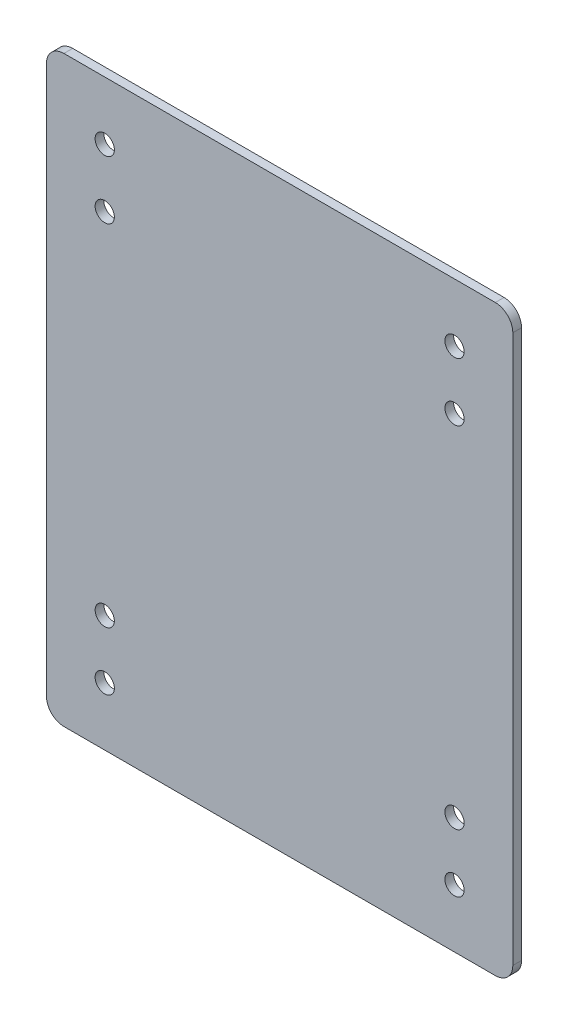
ISO-10303-21;
HEADER;
FILE_DESCRIPTION(('STEP AP214'),'2;1');
FILE_NAME('part.step','',(''),(''),'','','');
FILE_SCHEMA(('AUTOMOTIVE_DESIGN { 1 0 10303 214 1 1 1 1 }'));
ENDSEC;
DATA;
#1=APPLICATION_CONTEXT('core data for automotive mechanical design processes');
#2=APPLICATION_PROTOCOL_DEFINITION('international standard','automotive_design',2000,#1);
#3=PRODUCT_CONTEXT('',#1,'mechanical');
#4=PRODUCT('Part','Part','',(#3));
#5=PRODUCT_RELATED_PRODUCT_CATEGORY('part','',(#4));
#6=PRODUCT_DEFINITION_FORMATION('','',#4);
#7=PRODUCT_DEFINITION_CONTEXT('part definition',#1,'design');
#8=PRODUCT_DEFINITION('design','',#6,#7);
#9=PRODUCT_DEFINITION_SHAPE('','',#8);
#10=(LENGTH_UNIT() NAMED_UNIT(*) SI_UNIT(.MILLI.,.METRE.));
#11=(NAMED_UNIT(*) PLANE_ANGLE_UNIT() SI_UNIT($,.RADIAN.));
#12=(NAMED_UNIT(*) SI_UNIT($,.STERADIAN.) SOLID_ANGLE_UNIT());
#13=UNCERTAINTY_MEASURE_WITH_UNIT(LENGTH_MEASURE(1.E-05),#10,'distance_accuracy_value','');
#14=(GEOMETRIC_REPRESENTATION_CONTEXT(3) GLOBAL_UNCERTAINTY_ASSIGNED_CONTEXT((#13)) GLOBAL_UNIT_ASSIGNED_CONTEXT((#10,
#11,#12)) REPRESENTATION_CONTEXT('',''));
#15=CARTESIAN_POINT('',(0.,0.,0.));
#16=DIRECTION('',(0.,0.,1.));
#17=DIRECTION('',(1.,0.,0.));
#18=AXIS2_PLACEMENT_3D('',#15,#16,#17);
#19=CARTESIAN_POINT('',(77.,97.,0.));
#20=DIRECTION('',(0.,0.,1.));
#21=DIRECTION('',(1.,0.,0.));
#22=AXIS2_PLACEMENT_3D('',#19,#20,#21);
#23=CYLINDRICAL_SURFACE('',#22,3.);
#24=DIRECTION('',(0.,0.,1.));
#25=VECTOR('',#24,1.);
#26=CARTESIAN_POINT('',(80.,97.,0.));
#27=LINE('',#26,#25);
#28=CARTESIAN_POINT('',(80.,97.,-1.5));
#29=VERTEX_POINT('',#28);
#30=CARTESIAN_POINT('',(80.,97.,0.));
#31=VERTEX_POINT('',#30);
#32=EDGE_CURVE('E11',#29,#31,#27,.T.);
#33=ORIENTED_EDGE('',*,*,#32,.F.);
#34=CARTESIAN_POINT('',(77.,97.,-1.5));
#35=DIRECTION('',(0.,0.,1.));
#36=DIRECTION('',(1.,0.,0.));
#37=AXIS2_PLACEMENT_3D('',#34,#35,#36);
#38=CIRCLE('',#37,3.);
#39=CARTESIAN_POINT('',(77.,100.,-1.5));
#40=VERTEX_POINT('',#39);
#41=EDGE_CURVE('E107',#29,#40,#38,.T.);
#42=ORIENTED_EDGE('',*,*,#41,.T.);
#43=DIRECTION('',(0.,0.,1.));
#44=VECTOR('',#43,1.);
#45=CARTESIAN_POINT('',(77.,100.,0.));
#46=LINE('',#45,#44);
#47=CARTESIAN_POINT('',(77.,100.,0.));
#48=VERTEX_POINT('',#47);
#49=EDGE_CURVE('E50',#40,#48,#46,.T.);
#50=ORIENTED_EDGE('',*,*,#49,.T.);
#51=CARTESIAN_POINT('',(77.,97.,0.));
#52=DIRECTION('',(0.,0.,1.));
#53=DIRECTION('',(-1.,0.,0.));
#54=AXIS2_PLACEMENT_3D('',#51,#52,#53);
#55=CIRCLE('',#54,3.);
#56=EDGE_CURVE('E160',#31,#48,#55,.T.);
#57=ORIENTED_EDGE('',*,*,#56,.F.);
#58=EDGE_LOOP('',(#33,#42,#50,#57));
#59=FACE_BOUND('',#58,.T.);
#60=ADVANCED_FACE('F40',(#59),#23,.T.);
#61=CARTESIAN_POINT('',(3.00000000000002,100.,0.));
#62=DIRECTION('',(0.,1.,0.));
#63=DIRECTION('',(-1.,0.,0.));
#64=AXIS2_PLACEMENT_3D('',#61,#62,#63);
#65=PLANE('',#64);
#66=ORIENTED_EDGE('',*,*,#49,.F.);
#67=DIRECTION('',(1.,0.,0.));
#68=VECTOR('',#67,1.);
#69=CARTESIAN_POINT('',(77.,100.,-1.5));
#70=LINE('',#69,#68);
#71=CARTESIAN_POINT('',(3.00000000000002,100.,-1.5));
#72=VERTEX_POINT('',#71);
#73=EDGE_CURVE('E138',#40,#72,#70,.F.);
#74=ORIENTED_EDGE('',*,*,#73,.T.);
#75=DIRECTION('',(0.,0.,1.));
#76=VECTOR('',#75,1.);
#77=CARTESIAN_POINT('',(3.00000000000002,100.,0.));
#78=LINE('',#77,#76);
#79=CARTESIAN_POINT('',(3.00000000000002,100.,0.));
#80=VERTEX_POINT('',#79);
#81=EDGE_CURVE('E153',#72,#80,#78,.T.);
#82=ORIENTED_EDGE('',*,*,#81,.T.);
#83=DIRECTION('',(-1.,0.,0.));
#84=VECTOR('',#83,1.);
#85=CARTESIAN_POINT('',(3.00000000000002,100.,0.));
#86=LINE('',#85,#84);
#87=EDGE_CURVE('E169',#48,#80,#86,.T.);
#88=ORIENTED_EDGE('',*,*,#87,.F.);
#89=EDGE_LOOP('',(#66,#74,#82,#88));
#90=FACE_BOUND('',#89,.T.);
#91=ADVANCED_FACE('F173',(#90),#65,.T.);
#92=CARTESIAN_POINT('',(3.,97.,0.));
#93=DIRECTION('',(0.,0.,1.));
#94=DIRECTION('',(1.,0.,0.));
#95=AXIS2_PLACEMENT_3D('',#92,#93,#94);
#96=CYLINDRICAL_SURFACE('',#95,3.);
#97=ORIENTED_EDGE('',*,*,#81,.F.);
#98=CARTESIAN_POINT('',(3.,97.,-1.5));
#99=DIRECTION('',(0.,0.,1.));
#100=DIRECTION('',(1.,0.,0.));
#101=AXIS2_PLACEMENT_3D('',#98,#99,#100);
#102=CIRCLE('',#101,3.);
#103=CARTESIAN_POINT('',(0.,97.,-1.5));
#104=VERTEX_POINT('',#103);
#105=EDGE_CURVE('E134',#72,#104,#102,.T.);
#106=ORIENTED_EDGE('',*,*,#105,.T.);
#107=DIRECTION('',(0.,0.,1.));
#108=VECTOR('',#107,1.);
#109=CARTESIAN_POINT('',(0.,97.,0.));
#110=LINE('',#109,#108);
#111=CARTESIAN_POINT('',(0.,97.,0.));
#112=VERTEX_POINT('',#111);
#113=EDGE_CURVE('E150',#104,#112,#110,.T.);
#114=ORIENTED_EDGE('',*,*,#113,.T.);
#115=CARTESIAN_POINT('',(3.,97.,0.));
#116=DIRECTION('',(0.,0.,1.));
#117=DIRECTION('',(-1.,0.,0.));
#118=AXIS2_PLACEMENT_3D('',#115,#116,#117);
#119=CIRCLE('',#118,3.);
#120=EDGE_CURVE('E175',#80,#112,#119,.T.);
#121=ORIENTED_EDGE('',*,*,#120,.F.);
#122=EDGE_LOOP('',(#97,#106,#114,#121));
#123=FACE_BOUND('',#122,.T.);
#124=ADVANCED_FACE('F245',(#123),#96,.T.);
#125=CARTESIAN_POINT('',(0.,3.00000000000002,0.));
#126=DIRECTION('',(-1.,0.,0.));
#127=DIRECTION('',(0.,-1.,0.));
#128=AXIS2_PLACEMENT_3D('',#125,#126,#127);
#129=PLANE('',#128);
#130=ORIENTED_EDGE('',*,*,#113,.F.);
#131=DIRECTION('',(0.,1.,0.));
#132=VECTOR('',#131,1.);
#133=CARTESIAN_POINT('',(0.,3.,-1.5));
#134=LINE('',#133,#132);
#135=CARTESIAN_POINT('',(0.,3.,-1.5));
#136=VERTEX_POINT('',#135);
#137=EDGE_CURVE('E130',#104,#136,#134,.F.);
#138=ORIENTED_EDGE('',*,*,#137,.T.);
#139=DIRECTION('',(0.,0.,1.));
#140=VECTOR('',#139,1.);
#141=CARTESIAN_POINT('',(0.,3.,0.));
#142=LINE('',#141,#140);
#143=CARTESIAN_POINT('',(0.,3.,0.));
#144=VERTEX_POINT('',#143);
#145=EDGE_CURVE('E147',#136,#144,#142,.T.);
#146=ORIENTED_EDGE('',*,*,#145,.T.);
#147=DIRECTION('',(0.,-1.,0.));
#148=VECTOR('',#147,1.);
#149=CARTESIAN_POINT('',(0.,3.00000000000002,0.));
#150=LINE('',#149,#148);
#151=EDGE_CURVE('E180',#112,#144,#150,.T.);
#152=ORIENTED_EDGE('',*,*,#151,.F.);
#153=EDGE_LOOP('',(#130,#138,#146,#152));
#154=FACE_BOUND('',#153,.T.);
#155=ADVANCED_FACE('F250',(#154),#129,.T.);
#156=CARTESIAN_POINT('',(3.,3.,0.));
#157=DIRECTION('',(0.,0.,1.));
#158=DIRECTION('',(1.,0.,0.));
#159=AXIS2_PLACEMENT_3D('',#156,#157,#158);
#160=CYLINDRICAL_SURFACE('',#159,3.);
#161=ORIENTED_EDGE('',*,*,#145,.F.);
#162=CARTESIAN_POINT('',(3.,3.,-1.5));
#163=DIRECTION('',(0.,0.,1.));
#164=DIRECTION('',(1.,0.,0.));
#165=AXIS2_PLACEMENT_3D('',#162,#163,#164);
#166=CIRCLE('',#165,3.);
#167=CARTESIAN_POINT('',(3.00000000000002,0.,-1.5));
#168=VERTEX_POINT('',#167);
#169=EDGE_CURVE('E126',#136,#168,#166,.T.);
#170=ORIENTED_EDGE('',*,*,#169,.T.);
#171=DIRECTION('',(0.,0.,1.));
#172=VECTOR('',#171,1.);
#173=CARTESIAN_POINT('',(3.00000000000002,0.,0.));
#174=LINE('',#173,#172);
#175=CARTESIAN_POINT('',(3.00000000000002,0.,0.));
#176=VERTEX_POINT('',#175);
#177=EDGE_CURVE('E145',#168,#176,#174,.T.);
#178=ORIENTED_EDGE('',*,*,#177,.T.);
#179=CARTESIAN_POINT('',(3.,3.,0.));
#180=DIRECTION('',(0.,0.,1.));
#181=DIRECTION('',(-1.,0.,0.));
#182=AXIS2_PLACEMENT_3D('',#179,#180,#181);
#183=CIRCLE('',#182,3.);
#184=EDGE_CURVE('E187',#144,#176,#183,.T.);
#185=ORIENTED_EDGE('',*,*,#184,.F.);
#186=EDGE_LOOP('',(#161,#170,#178,#185));
#187=FACE_BOUND('',#186,.T.);
#188=ADVANCED_FACE('F254',(#187),#160,.T.);
#189=CARTESIAN_POINT('',(3.00000000000002,0.,0.));
#190=DIRECTION('',(0.,-1.,0.));
#191=DIRECTION('',(1.,0.,0.));
#192=AXIS2_PLACEMENT_3D('',#189,#190,#191);
#193=PLANE('',#192);
#194=ORIENTED_EDGE('',*,*,#177,.F.);
#195=DIRECTION('',(1.,0.,0.));
#196=VECTOR('',#195,1.);
#197=CARTESIAN_POINT('',(77.,0.,-1.5));
#198=LINE('',#197,#196);
#199=CARTESIAN_POINT('',(77.,0.,-1.5));
#200=VERTEX_POINT('',#199);
#201=EDGE_CURVE('E122',#168,#200,#198,.T.);
#202=ORIENTED_EDGE('',*,*,#201,.T.);
#203=DIRECTION('',(0.,0.,1.));
#204=VECTOR('',#203,1.);
#205=CARTESIAN_POINT('',(77.,0.,0.));
#206=LINE('',#205,#204);
#207=CARTESIAN_POINT('',(77.,0.,0.));
#208=VERTEX_POINT('',#207);
#209=EDGE_CURVE('E58',#200,#208,#206,.T.);
#210=ORIENTED_EDGE('',*,*,#209,.T.);
#211=DIRECTION('',(1.,0.,0.));
#212=VECTOR('',#211,1.);
#213=CARTESIAN_POINT('',(3.00000000000002,0.,0.));
#214=LINE('',#213,#212);
#215=EDGE_CURVE('E100',#176,#208,#214,.T.);
#216=ORIENTED_EDGE('',*,*,#215,.F.);
#217=EDGE_LOOP('',(#194,#202,#210,#216));
#218=FACE_BOUND('',#217,.T.);
#219=ADVANCED_FACE('F258',(#218),#193,.T.);
#220=CARTESIAN_POINT('',(77.,3.,0.));
#221=DIRECTION('',(0.,0.,1.));
#222=DIRECTION('',(1.,0.,0.));
#223=AXIS2_PLACEMENT_3D('',#220,#221,#222);
#224=CYLINDRICAL_SURFACE('',#223,3.);
#225=ORIENTED_EDGE('',*,*,#209,.F.);
#226=CARTESIAN_POINT('',(77.,3.,-1.5));
#227=DIRECTION('',(0.,0.,1.));
#228=DIRECTION('',(1.,0.,0.));
#229=AXIS2_PLACEMENT_3D('',#226,#227,#228);
#230=CIRCLE('',#229,3.);
#231=CARTESIAN_POINT('',(80.,3.00000000000002,-1.5));
#232=VERTEX_POINT('',#231);
#233=EDGE_CURVE('E105',#200,#232,#230,.T.);
#234=ORIENTED_EDGE('',*,*,#233,.T.);
#235=DIRECTION('',(0.,0.,1.));
#236=VECTOR('',#235,1.);
#237=CARTESIAN_POINT('',(80.,3.00000000000002,0.));
#238=LINE('',#237,#236);
#239=CARTESIAN_POINT('',(80.,3.00000000000002,0.));
#240=VERTEX_POINT('',#239);
#241=EDGE_CURVE('E44',#232,#240,#238,.T.);
#242=ORIENTED_EDGE('',*,*,#241,.T.);
#243=CARTESIAN_POINT('',(77.,3.,0.));
#244=DIRECTION('',(0.,0.,1.));
#245=DIRECTION('',(1.,0.,0.));
#246=AXIS2_PLACEMENT_3D('',#243,#244,#245);
#247=CIRCLE('',#246,3.);
#248=EDGE_CURVE('E346',#208,#240,#247,.T.);
#249=ORIENTED_EDGE('',*,*,#248,.F.);
#250=EDGE_LOOP('',(#225,#234,#242,#249));
#251=FACE_BOUND('',#250,.T.);
#252=ADVANCED_FACE('F110',(#251),#224,.T.);
#253=CARTESIAN_POINT('',(70.0000000000001,90.,0.));
#254=DIRECTION('',(0.,0.,1.));
#255=DIRECTION('',(1.,0.,0.));
#256=AXIS2_PLACEMENT_3D('',#253,#254,#255);
#257=CYLINDRICAL_SURFACE('',#256,1.65);
#258=CARTESIAN_POINT('',(70.0000000000001,90.,0.));
#259=DIRECTION('',(0.,0.,1.));
#260=DIRECTION('',(1.,0.,0.));
#261=AXIS2_PLACEMENT_3D('',#258,#259,#260);
#262=CIRCLE('',#261,1.65);
#263=CARTESIAN_POINT('',(71.6500000000001,90.,0.));
#264=VERTEX_POINT('',#263);
#265=EDGE_CURVE('E125',#264,#264,#262,.T.);
#266=ORIENTED_EDGE('',*,*,#265,.T.);
#267=EDGE_LOOP('',(#266));
#268=FACE_BOUND('',#267,.T.);
#269=CARTESIAN_POINT('',(70.0000000000001,90.,-1.5));
#270=DIRECTION('',(0.,0.,1.));
#271=DIRECTION('',(1.,0.,0.));
#272=AXIS2_PLACEMENT_3D('',#269,#270,#271);
#273=CIRCLE('',#272,1.65);
#274=CARTESIAN_POINT('',(71.6500000000001,90.,-1.5));
#275=VERTEX_POINT('',#274);
#276=EDGE_CURVE('E194',#275,#275,#273,.T.);
#277=ORIENTED_EDGE('',*,*,#276,.F.);
#278=EDGE_LOOP('',(#277));
#279=FACE_BOUND('',#278,.T.);
#280=ADVANCED_FACE('F263',(#268,#279),#257,.F.);
#281=CARTESIAN_POINT('',(9.99999999999998,90.,0.));
#282=DIRECTION('',(0.,0.,1.));
#283=DIRECTION('',(1.,0.,0.));
#284=AXIS2_PLACEMENT_3D('',#281,#282,#283);
#285=CYLINDRICAL_SURFACE('',#284,1.65);
#286=CARTESIAN_POINT('',(9.99999999999998,90.,0.));
#287=DIRECTION('',(0.,0.,1.));
#288=DIRECTION('',(1.,0.,0.));
#289=AXIS2_PLACEMENT_3D('',#286,#287,#288);
#290=CIRCLE('',#289,1.65);
#291=CARTESIAN_POINT('',(11.65,90.,0.));
#292=VERTEX_POINT('',#291);
#293=EDGE_CURVE('E325',#292,#292,#290,.T.);
#294=ORIENTED_EDGE('',*,*,#293,.T.);
#295=EDGE_LOOP('',(#294));
#296=FACE_BOUND('',#295,.T.);
#297=CARTESIAN_POINT('',(9.99999999999998,90.,-1.5));
#298=DIRECTION('',(0.,0.,1.));
#299=DIRECTION('',(1.,0.,0.));
#300=AXIS2_PLACEMENT_3D('',#297,#298,#299);
#301=CIRCLE('',#300,1.65);
#302=CARTESIAN_POINT('',(11.65,90.,-1.5));
#303=VERTEX_POINT('',#302);
#304=EDGE_CURVE('E198',#303,#303,#301,.T.);
#305=ORIENTED_EDGE('',*,*,#304,.F.);
#306=EDGE_LOOP('',(#305));
#307=FACE_BOUND('',#306,.T.);
#308=ADVANCED_FACE('F267',(#296,#307),#285,.F.);
#309=CARTESIAN_POINT('',(9.99999999999998,10.,0.));
#310=DIRECTION('',(0.,0.,1.));
#311=DIRECTION('',(1.,0.,0.));
#312=AXIS2_PLACEMENT_3D('',#309,#310,#311);
#313=CYLINDRICAL_SURFACE('',#312,1.65);
#314=CARTESIAN_POINT('',(9.99999999999998,10.,0.));
#315=DIRECTION('',(0.,0.,1.));
#316=DIRECTION('',(1.,0.,0.));
#317=AXIS2_PLACEMENT_3D('',#314,#315,#316);
#318=CIRCLE('',#317,1.65);
#319=CARTESIAN_POINT('',(11.65,10.,0.));
#320=VERTEX_POINT('',#319);
#321=EDGE_CURVE('E329',#320,#320,#318,.T.);
#322=ORIENTED_EDGE('',*,*,#321,.T.);
#323=EDGE_LOOP('',(#322));
#324=FACE_BOUND('',#323,.T.);
#325=CARTESIAN_POINT('',(9.99999999999998,10.,-1.5));
#326=DIRECTION('',(0.,0.,1.));
#327=DIRECTION('',(1.,0.,0.));
#328=AXIS2_PLACEMENT_3D('',#325,#326,#327);
#329=CIRCLE('',#328,1.65);
#330=CARTESIAN_POINT('',(11.65,10.,-1.5));
#331=VERTEX_POINT('',#330);
#332=EDGE_CURVE('E202',#331,#331,#329,.T.);
#333=ORIENTED_EDGE('',*,*,#332,.F.);
#334=EDGE_LOOP('',(#333));
#335=FACE_BOUND('',#334,.T.);
#336=ADVANCED_FACE('F273',(#324,#335),#313,.F.);
#337=CARTESIAN_POINT('',(70.,10.,0.));
#338=DIRECTION('',(0.,0.,1.));
#339=DIRECTION('',(1.,0.,0.));
#340=AXIS2_PLACEMENT_3D('',#337,#338,#339);
#341=CYLINDRICAL_SURFACE('',#340,1.65);
#342=CARTESIAN_POINT('',(70.,10.,0.));
#343=DIRECTION('',(0.,0.,1.));
#344=DIRECTION('',(1.,0.,0.));
#345=AXIS2_PLACEMENT_3D('',#342,#343,#344);
#346=CIRCLE('',#345,1.65);
#347=CARTESIAN_POINT('',(71.65,10.,0.));
#348=VERTEX_POINT('',#347);
#349=EDGE_CURVE('E333',#348,#348,#346,.T.);
#350=ORIENTED_EDGE('',*,*,#349,.T.);
#351=EDGE_LOOP('',(#350));
#352=FACE_BOUND('',#351,.T.);
#353=CARTESIAN_POINT('',(70.,10.,-1.5));
#354=DIRECTION('',(0.,0.,1.));
#355=DIRECTION('',(1.,0.,0.));
#356=AXIS2_PLACEMENT_3D('',#353,#354,#355);
#357=CIRCLE('',#356,1.65);
#358=CARTESIAN_POINT('',(71.65,10.,-1.5));
#359=VERTEX_POINT('',#358);
#360=EDGE_CURVE('E206',#359,#359,#357,.T.);
#361=ORIENTED_EDGE('',*,*,#360,.F.);
#362=EDGE_LOOP('',(#361));
#363=FACE_BOUND('',#362,.T.);
#364=ADVANCED_FACE('F283',(#352,#363),#341,.F.);
#365=CARTESIAN_POINT('',(9.99999999999998,80.,0.));
#366=DIRECTION('',(0.,0.,1.));
#367=DIRECTION('',(1.,0.,0.));
#368=AXIS2_PLACEMENT_3D('',#365,#366,#367);
#369=CYLINDRICAL_SURFACE('',#368,1.65);
#370=CARTESIAN_POINT('',(9.99999999999998,80.,0.));
#371=DIRECTION('',(0.,0.,1.));
#372=DIRECTION('',(1.,0.,0.));
#373=AXIS2_PLACEMENT_3D('',#370,#371,#372);
#374=CIRCLE('',#373,1.65);
#375=CARTESIAN_POINT('',(11.65,80.,0.));
#376=VERTEX_POINT('',#375);
#377=EDGE_CURVE('E295',#376,#376,#374,.T.);
#378=ORIENTED_EDGE('',*,*,#377,.T.);
#379=EDGE_LOOP('',(#378));
#380=FACE_BOUND('',#379,.T.);
#381=CARTESIAN_POINT('',(9.99999999999998,80.,-1.5));
#382=DIRECTION('',(0.,0.,1.));
#383=DIRECTION('',(1.,0.,0.));
#384=AXIS2_PLACEMENT_3D('',#381,#382,#383);
#385=CIRCLE('',#384,1.65);
#386=CARTESIAN_POINT('',(11.65,80.,-1.5));
#387=VERTEX_POINT('',#386);
#388=EDGE_CURVE('E210',#387,#387,#385,.T.);
#389=ORIENTED_EDGE('',*,*,#388,.F.);
#390=EDGE_LOOP('',(#389));
#391=FACE_BOUND('',#390,.T.);
#392=ADVANCED_FACE('F237',(#380,#391),#369,.F.);
#393=CARTESIAN_POINT('',(9.99999999999999,20.,0.));
#394=DIRECTION('',(0.,0.,1.));
#395=DIRECTION('',(1.,0.,0.));
#396=AXIS2_PLACEMENT_3D('',#393,#394,#395);
#397=CYLINDRICAL_SURFACE('',#396,1.65);
#398=CARTESIAN_POINT('',(9.99999999999999,20.,0.));
#399=DIRECTION('',(0.,0.,1.));
#400=DIRECTION('',(1.,0.,0.));
#401=AXIS2_PLACEMENT_3D('',#398,#399,#400);
#402=CIRCLE('',#401,1.65);
#403=CARTESIAN_POINT('',(11.65,20.,0.));
#404=VERTEX_POINT('',#403);
#405=EDGE_CURVE('E338',#404,#404,#402,.T.);
#406=ORIENTED_EDGE('',*,*,#405,.T.);
#407=EDGE_LOOP('',(#406));
#408=FACE_BOUND('',#407,.T.);
#409=CARTESIAN_POINT('',(9.99999999999999,20.,-1.5));
#410=DIRECTION('',(0.,0.,1.));
#411=DIRECTION('',(1.,0.,0.));
#412=AXIS2_PLACEMENT_3D('',#409,#410,#411);
#413=CIRCLE('',#412,1.65);
#414=CARTESIAN_POINT('',(11.65,20.,-1.5));
#415=VERTEX_POINT('',#414);
#416=EDGE_CURVE('E214',#415,#415,#413,.T.);
#417=ORIENTED_EDGE('',*,*,#416,.F.);
#418=EDGE_LOOP('',(#417));
#419=FACE_BOUND('',#418,.T.);
#420=ADVANCED_FACE('F228',(#408,#419),#397,.F.);
#421=CARTESIAN_POINT('',(70.,20.,0.));
#422=DIRECTION('',(0.,0.,1.));
#423=DIRECTION('',(1.,0.,0.));
#424=AXIS2_PLACEMENT_3D('',#421,#422,#423);
#425=CYLINDRICAL_SURFACE('',#424,1.65);
#426=CARTESIAN_POINT('',(70.,20.,0.));
#427=DIRECTION('',(0.,0.,1.));
#428=DIRECTION('',(1.,0.,0.));
#429=AXIS2_PLACEMENT_3D('',#426,#427,#428);
#430=CIRCLE('',#429,1.65);
#431=CARTESIAN_POINT('',(71.65,20.,0.));
#432=VERTEX_POINT('',#431);
#433=EDGE_CURVE('E341',#432,#432,#430,.T.);
#434=ORIENTED_EDGE('',*,*,#433,.T.);
#435=EDGE_LOOP('',(#434));
#436=FACE_BOUND('',#435,.T.);
#437=CARTESIAN_POINT('',(70.,20.,-1.5));
#438=DIRECTION('',(0.,0.,1.));
#439=DIRECTION('',(1.,0.,0.));
#440=AXIS2_PLACEMENT_3D('',#437,#438,#439);
#441=CIRCLE('',#440,1.65);
#442=CARTESIAN_POINT('',(71.65,20.,-1.5));
#443=VERTEX_POINT('',#442);
#444=EDGE_CURVE('E118',#443,#443,#441,.T.);
#445=ORIENTED_EDGE('',*,*,#444,.F.);
#446=EDGE_LOOP('',(#445));
#447=FACE_BOUND('',#446,.T.);
#448=ADVANCED_FACE('F225',(#436,#447),#425,.F.);
#449=CARTESIAN_POINT('',(70.,80.,0.));
#450=DIRECTION('',(0.,0.,1.));
#451=DIRECTION('',(1.,0.,0.));
#452=AXIS2_PLACEMENT_3D('',#449,#450,#451);
#453=CYLINDRICAL_SURFACE('',#452,1.65);
#454=CARTESIAN_POINT('',(70.,80.,0.));
#455=DIRECTION('',(0.,0.,1.));
#456=DIRECTION('',(1.,0.,0.));
#457=AXIS2_PLACEMENT_3D('',#454,#455,#456);
#458=CIRCLE('',#457,1.65);
#459=CARTESIAN_POINT('',(71.65,80.,0.));
#460=VERTEX_POINT('',#459);
#461=EDGE_CURVE('E344',#460,#460,#458,.T.);
#462=ORIENTED_EDGE('',*,*,#461,.T.);
#463=EDGE_LOOP('',(#462));
#464=FACE_BOUND('',#463,.T.);
#465=CARTESIAN_POINT('',(70.,80.,-1.5));
#466=DIRECTION('',(0.,0.,1.));
#467=DIRECTION('',(1.,0.,0.));
#468=AXIS2_PLACEMENT_3D('',#465,#466,#467);
#469=CIRCLE('',#468,1.65);
#470=CARTESIAN_POINT('',(71.65,80.,-1.5));
#471=VERTEX_POINT('',#470);
#472=EDGE_CURVE('E112',#471,#471,#469,.T.);
#473=ORIENTED_EDGE('',*,*,#472,.F.);
#474=EDGE_LOOP('',(#473));
#475=FACE_BOUND('',#474,.T.);
#476=ADVANCED_FACE('F227',(#464,#475),#453,.F.);
#477=CARTESIAN_POINT('',(80.,3.00000000000002,0.));
#478=DIRECTION('',(1.,0.,0.));
#479=DIRECTION('',(0.,1.,0.));
#480=AXIS2_PLACEMENT_3D('',#477,#478,#479);
#481=PLANE('',#480);
#482=DIRECTION('',(0.,1.,0.));
#483=VECTOR('',#482,1.);
#484=CARTESIAN_POINT('',(80.,3.,-1.5));
#485=LINE('',#484,#483);
#486=EDGE_CURVE('E94',#232,#29,#485,.T.);
#487=ORIENTED_EDGE('',*,*,#486,.T.);
#488=ORIENTED_EDGE('',*,*,#32,.T.);
#489=DIRECTION('',(0.,1.,0.));
#490=VECTOR('',#489,1.);
#491=CARTESIAN_POINT('',(80.,3.00000000000002,0.));
#492=LINE('',#491,#490);
#493=EDGE_CURVE('E96',#240,#31,#492,.T.);
#494=ORIENTED_EDGE('',*,*,#493,.F.);
#495=ORIENTED_EDGE('',*,*,#241,.F.);
#496=EDGE_LOOP('',(#487,#488,#494,#495));
#497=FACE_BOUND('',#496,.T.);
#498=ADVANCED_FACE('F42',(#497),#481,.T.);
#499=CARTESIAN_POINT('',(77.,3.,0.));
#500=DIRECTION('',(0.,0.,1.));
#501=DIRECTION('',(1.,0.,0.));
#502=AXIS2_PLACEMENT_3D('',#499,#500,#501);
#503=PLANE('',#502);
#504=ORIENTED_EDGE('',*,*,#265,.F.);
#505=EDGE_LOOP('',(#504));
#506=FACE_BOUND('',#505,.T.);
#507=ORIENTED_EDGE('',*,*,#293,.F.);
#508=EDGE_LOOP('',(#507));
#509=FACE_BOUND('',#508,.T.);
#510=ORIENTED_EDGE('',*,*,#321,.F.);
#511=EDGE_LOOP('',(#510));
#512=FACE_BOUND('',#511,.T.);
#513=ORIENTED_EDGE('',*,*,#349,.F.);
#514=EDGE_LOOP('',(#513));
#515=FACE_BOUND('',#514,.T.);
#516=ORIENTED_EDGE('',*,*,#377,.F.);
#517=EDGE_LOOP('',(#516));
#518=FACE_BOUND('',#517,.T.);
#519=ORIENTED_EDGE('',*,*,#405,.F.);
#520=EDGE_LOOP('',(#519));
#521=FACE_BOUND('',#520,.T.);
#522=ORIENTED_EDGE('',*,*,#433,.F.);
#523=EDGE_LOOP('',(#522));
#524=FACE_BOUND('',#523,.T.);
#525=ORIENTED_EDGE('',*,*,#461,.F.);
#526=EDGE_LOOP('',(#525));
#527=FACE_BOUND('',#526,.T.);
#528=ORIENTED_EDGE('',*,*,#248,.T.);
#529=ORIENTED_EDGE('',*,*,#493,.T.);
#530=ORIENTED_EDGE('',*,*,#56,.T.);
#531=ORIENTED_EDGE('',*,*,#87,.T.);
#532=ORIENTED_EDGE('',*,*,#120,.T.);
#533=ORIENTED_EDGE('',*,*,#151,.T.);
#534=ORIENTED_EDGE('',*,*,#184,.T.);
#535=ORIENTED_EDGE('',*,*,#215,.T.);
#536=EDGE_LOOP('',(#528,#529,#530,#531,#532,#533,#534,#535));
#537=FACE_BOUND('',#536,.T.);
#538=ADVANCED_FACE('F167',(#506,#509,#512,#515,#518,#521,#524,#527,#537),#503,.T.);
#539=CARTESIAN_POINT('',(77.,3.,-1.5));
#540=DIRECTION('',(0.,0.,1.));
#541=DIRECTION('',(1.,0.,0.));
#542=AXIS2_PLACEMENT_3D('',#539,#540,#541);
#543=PLANE('',#542);
#544=ORIENTED_EDGE('',*,*,#276,.T.);
#545=EDGE_LOOP('',(#544));
#546=FACE_BOUND('',#545,.T.);
#547=ORIENTED_EDGE('',*,*,#304,.T.);
#548=EDGE_LOOP('',(#547));
#549=FACE_BOUND('',#548,.T.);
#550=ORIENTED_EDGE('',*,*,#332,.T.);
#551=EDGE_LOOP('',(#550));
#552=FACE_BOUND('',#551,.T.);
#553=ORIENTED_EDGE('',*,*,#360,.T.);
#554=EDGE_LOOP('',(#553));
#555=FACE_BOUND('',#554,.T.);
#556=ORIENTED_EDGE('',*,*,#388,.T.);
#557=EDGE_LOOP('',(#556));
#558=FACE_BOUND('',#557,.T.);
#559=ORIENTED_EDGE('',*,*,#416,.T.);
#560=EDGE_LOOP('',(#559));
#561=FACE_BOUND('',#560,.T.);
#562=ORIENTED_EDGE('',*,*,#444,.T.);
#563=EDGE_LOOP('',(#562));
#564=FACE_BOUND('',#563,.T.);
#565=ORIENTED_EDGE('',*,*,#472,.T.);
#566=EDGE_LOOP('',(#565));
#567=FACE_BOUND('',#566,.T.);
#568=ORIENTED_EDGE('',*,*,#233,.F.);
#569=ORIENTED_EDGE('',*,*,#201,.F.);
#570=ORIENTED_EDGE('',*,*,#169,.F.);
#571=ORIENTED_EDGE('',*,*,#137,.F.);
#572=ORIENTED_EDGE('',*,*,#105,.F.);
#573=ORIENTED_EDGE('',*,*,#73,.F.);
#574=ORIENTED_EDGE('',*,*,#41,.F.);
#575=ORIENTED_EDGE('',*,*,#486,.F.);
#576=EDGE_LOOP('',(#568,#569,#570,#571,#572,#573,#574,#575));
#577=FACE_BOUND('',#576,.T.);
#578=ADVANCED_FACE('F103',(#546,#549,#552,#555,#558,#561,#564,#567,#577),#543,.F.);
#579=CLOSED_SHELL('',(#60,#91,#124,#155,#188,#219,#252,#280,#308,#336,#364,#392,#420,#448,#476,
#498,#538,#578));
#580=MANIFOLD_SOLID_BREP('B2',#579);
#581=ADVANCED_BREP_SHAPE_REPRESENTATION('',(#18,#580),#14);
#582=SHAPE_DEFINITION_REPRESENTATION(#9,#581);
ENDSEC;
END-ISO-10303-21;
